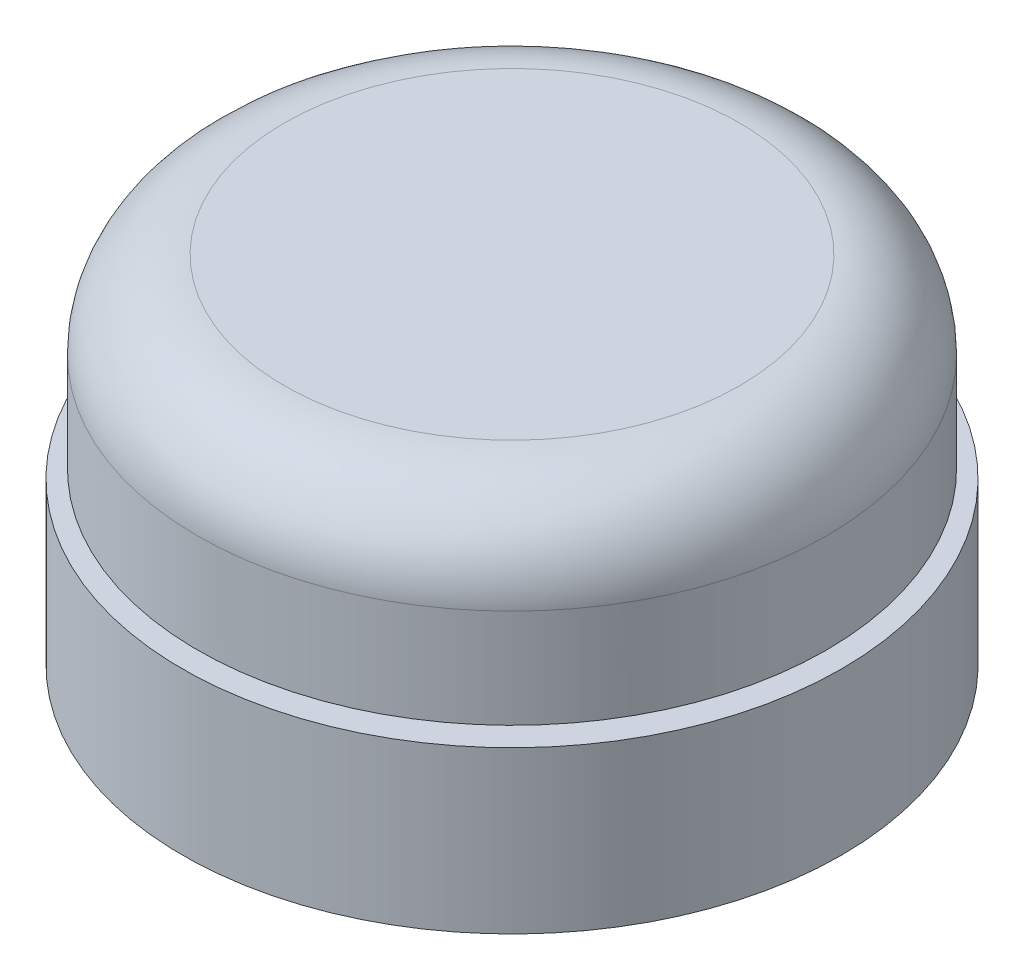
ISO-10303-21;
HEADER;
FILE_DESCRIPTION(('STEP AP214'),'2;1');
FILE_NAME('part.step','',(''),(''),'','','');
FILE_SCHEMA(('AUTOMOTIVE_DESIGN { 1 0 10303 214 1 1 1 1 }'));
ENDSEC;
DATA;
#1=APPLICATION_CONTEXT('core data for automotive mechanical design processes');
#2=APPLICATION_PROTOCOL_DEFINITION('international standard','automotive_design',2000,#1);
#3=PRODUCT_CONTEXT('',#1,'mechanical');
#4=PRODUCT('Part','Part','',(#3));
#5=PRODUCT_RELATED_PRODUCT_CATEGORY('part','',(#4));
#6=PRODUCT_DEFINITION_FORMATION('','',#4);
#7=PRODUCT_DEFINITION_CONTEXT('part definition',#1,'design');
#8=PRODUCT_DEFINITION('design','',#6,#7);
#9=PRODUCT_DEFINITION_SHAPE('','',#8);
#10=(LENGTH_UNIT() NAMED_UNIT(*) SI_UNIT(.MILLI.,.METRE.));
#11=(NAMED_UNIT(*) PLANE_ANGLE_UNIT() SI_UNIT($,.RADIAN.));
#12=(NAMED_UNIT(*) SI_UNIT($,.STERADIAN.) SOLID_ANGLE_UNIT());
#13=UNCERTAINTY_MEASURE_WITH_UNIT(LENGTH_MEASURE(1.E-05),#10,'distance_accuracy_value','');
#14=(GEOMETRIC_REPRESENTATION_CONTEXT(3) GLOBAL_UNCERTAINTY_ASSIGNED_CONTEXT((#13)) GLOBAL_UNIT_ASSIGNED_CONTEXT((#10,
#11,#12)) REPRESENTATION_CONTEXT('',''));
#15=CARTESIAN_POINT('',(0.,0.,0.));
#16=DIRECTION('',(0.,0.,1.));
#17=DIRECTION('',(1.,0.,0.));
#18=AXIS2_PLACEMENT_3D('',#15,#16,#17);
#19=CARTESIAN_POINT('',(0.,0.,0.));
#20=DIRECTION('',(0.,1.,0.));
#21=DIRECTION('',(1.,0.,0.));
#22=AXIS2_PLACEMENT_3D('',#19,#20,#21);
#23=PLANE('',#22);
#24=CARTESIAN_POINT('',(20.8596500450032,0.,-20.8596500450031));
#25=DIRECTION('',(0.,1.,0.));
#26=DIRECTION('',(1.,0.,0.));
#27=AXIS2_PLACEMENT_3D('',#24,#25,#26);
#28=CIRCLE('',#27,1.5);
#29=CARTESIAN_POINT('',(22.3596500450032,0.,-20.8596500450031));
#30=VERTEX_POINT('',#29);
#31=EDGE_CURVE('E56',#30,#30,#28,.T.);
#32=ORIENTED_EDGE('',*,*,#31,.T.);
#33=EDGE_LOOP('',(#32));
#34=FACE_BOUND('',#33,.T.);
#35=CARTESIAN_POINT('',(-20.8596500450031,0.,-20.8596500450032));
#36=DIRECTION('',(0.,1.,0.));
#37=DIRECTION('',(1.,0.,0.));
#38=AXIS2_PLACEMENT_3D('',#35,#36,#37);
#39=CIRCLE('',#38,1.5);
#40=CARTESIAN_POINT('',(-19.3596500450031,0.,-20.8596500450032));
#41=VERTEX_POINT('',#40);
#42=EDGE_CURVE('E64',#41,#41,#39,.T.);
#43=ORIENTED_EDGE('',*,*,#42,.T.);
#44=EDGE_LOOP('',(#43));
#45=FACE_BOUND('',#44,.T.);
#46=CARTESIAN_POINT('',(20.8596500450031,0.,20.8596500450032));
#47=DIRECTION('',(0.,1.,0.));
#48=DIRECTION('',(1.,0.,0.));
#49=AXIS2_PLACEMENT_3D('',#46,#47,#48);
#50=CIRCLE('',#49,1.5);
#51=CARTESIAN_POINT('',(22.3596500450031,0.,20.8596500450032));
#52=VERTEX_POINT('',#51);
#53=EDGE_CURVE('E69',#52,#52,#50,.T.);
#54=ORIENTED_EDGE('',*,*,#53,.T.);
#55=EDGE_LOOP('',(#54));
#56=FACE_BOUND('',#55,.T.);
#57=CARTESIAN_POINT('',(-20.8596500450032,0.,20.8596500450031));
#58=DIRECTION('',(0.,1.,0.));
#59=DIRECTION('',(1.,0.,0.));
#60=AXIS2_PLACEMENT_3D('',#57,#58,#59);
#61=CIRCLE('',#60,1.5);
#62=CARTESIAN_POINT('',(-19.3596500450032,0.,20.8596500450031));
#63=VERTEX_POINT('',#62);
#64=EDGE_CURVE('E77',#63,#63,#61,.T.);
#65=ORIENTED_EDGE('',*,*,#64,.T.);
#66=EDGE_LOOP('',(#65));
#67=FACE_BOUND('',#66,.T.);
#68=CARTESIAN_POINT('',(0.,0.,0.));
#69=DIRECTION('',(0.,1.,0.));
#70=DIRECTION('',(-1.,0.,0.));
#71=AXIS2_PLACEMENT_3D('',#68,#69,#70);
#72=CIRCLE('',#71,38.);
#73=CARTESIAN_POINT('',(-38.,0.,0.));
#74=VERTEX_POINT('',#73);
#75=EDGE_CURVE('E10',#74,#74,#72,.T.);
#76=ORIENTED_EDGE('',*,*,#75,.F.);
#77=EDGE_LOOP('',(#76));
#78=FACE_BOUND('',#77,.T.);
#79=ADVANCED_FACE('F15',(#34,#45,#56,#67,#78),#23,.F.);
#80=CARTESIAN_POINT('',(0.,18.6,0.));
#81=DIRECTION('',(0.,1.,0.));
#82=DIRECTION('',(1.,0.,0.));
#83=AXIS2_PLACEMENT_3D('',#80,#81,#82);
#84=PLANE('',#83);
#85=CARTESIAN_POINT('',(0.,18.6,0.));
#86=DIRECTION('',(0.,-1.,0.));
#87=DIRECTION('',(1.,0.,0.));
#88=AXIS2_PLACEMENT_3D('',#85,#86,#87);
#89=CIRCLE('',#88,32.5);
#90=CARTESIAN_POINT('',(32.5,18.6,0.));
#91=VERTEX_POINT('',#90);
#92=EDGE_CURVE('E31',#91,#91,#89,.T.);
#93=ORIENTED_EDGE('',*,*,#92,.T.);
#94=EDGE_LOOP('',(#93));
#95=FACE_BOUND('',#94,.T.);
#96=CARTESIAN_POINT('',(0.,18.6,0.));
#97=DIRECTION('',(0.,1.,0.));
#98=DIRECTION('',(-1.,0.,0.));
#99=AXIS2_PLACEMENT_3D('',#96,#97,#98);
#100=CIRCLE('',#99,38.);
#101=CARTESIAN_POINT('',(-38.,18.6,0.));
#102=VERTEX_POINT('',#101);
#103=EDGE_CURVE('E23',#102,#102,#100,.T.);
#104=ORIENTED_EDGE('',*,*,#103,.T.);
#105=EDGE_LOOP('',(#104));
#106=FACE_BOUND('',#105,.T.);
#107=ADVANCED_FACE('F105',(#95,#106),#84,.T.);
#108=CARTESIAN_POINT('',(0.,0.,0.));
#109=DIRECTION('',(0.,1.,0.));
#110=DIRECTION('',(-1.,0.,0.));
#111=AXIS2_PLACEMENT_3D('',#108,#109,#110);
#112=CYLINDRICAL_SURFACE('',#111,38.);
#113=ORIENTED_EDGE('',*,*,#75,.T.);
#114=EDGE_LOOP('',(#113));
#115=FACE_BOUND('',#114,.T.);
#116=ORIENTED_EDGE('',*,*,#103,.F.);
#117=EDGE_LOOP('',(#116));
#118=FACE_BOUND('',#117,.T.);
#119=ADVANCED_FACE('F17',(#115,#118),#112,.T.);
#120=CARTESIAN_POINT('',(0.,18.6,0.));
#121=DIRECTION('',(0.,1.,0.));
#122=DIRECTION('',(1.,0.,0.));
#123=AXIS2_PLACEMENT_3D('',#120,#121,#122);
#124=CYLINDRICAL_SURFACE('',#123,32.5);
#125=ORIENTED_EDGE('',*,*,#92,.F.);
#126=EDGE_LOOP('',(#125));
#127=FACE_BOUND('',#126,.T.);
#128=CARTESIAN_POINT('',(0.,19.6,0.));
#129=DIRECTION('',(0.,1.,0.));
#130=DIRECTION('',(1.,0.,0.));
#131=AXIS2_PLACEMENT_3D('',#128,#129,#130);
#132=CIRCLE('',#131,32.5);
#133=CARTESIAN_POINT('',(32.5,19.6,0.));
#134=VERTEX_POINT('',#133);
#135=EDGE_CURVE('E37',#134,#134,#132,.T.);
#136=ORIENTED_EDGE('',*,*,#135,.F.);
#137=EDGE_LOOP('',(#136));
#138=FACE_BOUND('',#137,.T.);
#139=ADVANCED_FACE('F124',(#127,#138),#124,.T.);
#140=CARTESIAN_POINT('',(0.,19.6,0.));
#141=DIRECTION('',(0.,1.,0.));
#142=DIRECTION('',(1.,0.,0.));
#143=AXIS2_PLACEMENT_3D('',#140,#141,#142);
#144=PLANE('',#143);
#145=ORIENTED_EDGE('',*,*,#135,.T.);
#146=EDGE_LOOP('',(#145));
#147=FACE_BOUND('',#146,.T.);
#148=CARTESIAN_POINT('',(0.,19.6,0.));
#149=DIRECTION('',(0.,1.,0.));
#150=DIRECTION('',(1.,0.,0.));
#151=AXIS2_PLACEMENT_3D('',#148,#149,#150);
#152=CIRCLE('',#151,36.25);
#153=CARTESIAN_POINT('',(36.25,19.6,0.));
#154=VERTEX_POINT('',#153);
#155=EDGE_CURVE('E43',#154,#154,#152,.T.);
#156=ORIENTED_EDGE('',*,*,#155,.F.);
#157=EDGE_LOOP('',(#156));
#158=FACE_BOUND('',#157,.T.);
#159=ADVANCED_FACE('F127',(#147,#158),#144,.F.);
#160=CARTESIAN_POINT('',(0.,41.,0.));
#161=DIRECTION('',(0.,1.,0.));
#162=DIRECTION('',(1.,0.,0.));
#163=AXIS2_PLACEMENT_3D('',#160,#161,#162);
#164=PLANE('',#163);
#165=CARTESIAN_POINT('',(0.,41.,0.));
#166=DIRECTION('',(0.,-1.,0.));
#167=DIRECTION('',(-1.,0.,0.));
#168=AXIS2_PLACEMENT_3D('',#165,#166,#167);
#169=CIRCLE('',#168,26.25);
#170=CARTESIAN_POINT('',(-26.25,41.,0.));
#171=VERTEX_POINT('',#170);
#172=EDGE_CURVE('E48',#171,#171,#169,.T.);
#173=ORIENTED_EDGE('',*,*,#172,.F.);
#174=EDGE_LOOP('',(#173));
#175=FACE_BOUND('',#174,.T.);
#176=ADVANCED_FACE('F121',(#175),#164,.T.);
#177=CARTESIAN_POINT('',(0.,19.6,0.));
#178=DIRECTION('',(0.,1.,0.));
#179=DIRECTION('',(1.,0.,0.));
#180=AXIS2_PLACEMENT_3D('',#177,#178,#179);
#181=CYLINDRICAL_SURFACE('',#180,36.25);
#182=ORIENTED_EDGE('',*,*,#155,.T.);
#183=EDGE_LOOP('',(#182));
#184=FACE_BOUND('',#183,.T.);
#185=CARTESIAN_POINT('',(0.,31.,0.));
#186=DIRECTION('',(0.,1.,0.));
#187=DIRECTION('',(-1.,0.,0.));
#188=AXIS2_PLACEMENT_3D('',#185,#186,#187);
#189=CIRCLE('',#188,36.25);
#190=CARTESIAN_POINT('',(-36.25,31.,0.));
#191=VERTEX_POINT('',#190);
#192=EDGE_CURVE('E47',#191,#191,#189,.T.);
#193=ORIENTED_EDGE('',*,*,#192,.F.);
#194=EDGE_LOOP('',(#193));
#195=FACE_BOUND('',#194,.T.);
#196=ADVANCED_FACE('F118',(#184,#195),#181,.T.);
#197=CARTESIAN_POINT('',(0.,31.,0.));
#198=DIRECTION('',(0.,1.,0.));
#199=DIRECTION('',(0.,0.,1.));
#200=AXIS2_PLACEMENT_3D('',#197,#198,#199);
#201=TOROIDAL_SURFACE('',#200,26.25,10.);
#202=ORIENTED_EDGE('',*,*,#192,.T.);
#203=EDGE_LOOP('',(#202));
#204=FACE_BOUND('',#203,.T.);
#205=ORIENTED_EDGE('',*,*,#172,.T.);
#206=EDGE_LOOP('',(#205));
#207=FACE_BOUND('',#206,.T.);
#208=ADVANCED_FACE('F120',(#204,#207),#201,.T.);
#209=CARTESIAN_POINT('',(20.8596500450032,4.,-20.8596500450031));
#210=DIRECTION('',(0.,-1.,0.));
#211=DIRECTION('',(0.,0.,-1.));
#212=AXIS2_PLACEMENT_3D('',#209,#210,#211);
#213=PLANE('',#212);
#214=CARTESIAN_POINT('',(20.8596500450032,4.,-20.8596500450031));
#215=DIRECTION('',(0.,1.,0.));
#216=DIRECTION('',(1.,0.,0.));
#217=AXIS2_PLACEMENT_3D('',#214,#215,#216);
#218=CIRCLE('',#217,1.5);
#219=CARTESIAN_POINT('',(22.3596500450032,4.,-20.8596500450031));
#220=VERTEX_POINT('',#219);
#221=EDGE_CURVE('E52',#220,#220,#218,.T.);
#222=ORIENTED_EDGE('',*,*,#221,.F.);
#223=EDGE_LOOP('',(#222));
#224=FACE_BOUND('',#223,.T.);
#225=ADVANCED_FACE('F116',(#224),#213,.T.);
#226=CARTESIAN_POINT('',(20.8596500450032,0.,-20.8596500450031));
#227=DIRECTION('',(0.,1.,0.));
#228=DIRECTION('',(1.,0.,0.));
#229=AXIS2_PLACEMENT_3D('',#226,#227,#228);
#230=CYLINDRICAL_SURFACE('',#229,1.5);
#231=ORIENTED_EDGE('',*,*,#221,.T.);
#232=EDGE_LOOP('',(#231));
#233=FACE_BOUND('',#232,.T.);
#234=ORIENTED_EDGE('',*,*,#31,.F.);
#235=EDGE_LOOP('',(#234));
#236=FACE_BOUND('',#235,.T.);
#237=ADVANCED_FACE('F143',(#233,#236),#230,.F.);
#238=CARTESIAN_POINT('',(-20.8596500450031,4.,-20.8596500450032));
#239=DIRECTION('',(0.,-1.,0.));
#240=DIRECTION('',(0.,0.,-1.));
#241=AXIS2_PLACEMENT_3D('',#238,#239,#240);
#242=PLANE('',#241);
#243=CARTESIAN_POINT('',(-20.8596500450031,4.,-20.8596500450032));
#244=DIRECTION('',(0.,1.,0.));
#245=DIRECTION('',(1.,0.,0.));
#246=AXIS2_PLACEMENT_3D('',#243,#244,#245);
#247=CIRCLE('',#246,1.5);
#248=CARTESIAN_POINT('',(-19.3596500450031,4.,-20.8596500450032));
#249=VERTEX_POINT('',#248);
#250=EDGE_CURVE('E60',#249,#249,#247,.T.);
#251=ORIENTED_EDGE('',*,*,#250,.F.);
#252=EDGE_LOOP('',(#251));
#253=FACE_BOUND('',#252,.T.);
#254=ADVANCED_FACE('F152',(#253),#242,.T.);
#255=CARTESIAN_POINT('',(-20.8596500450031,0.,-20.8596500450032));
#256=DIRECTION('',(0.,1.,0.));
#257=DIRECTION('',(1.,0.,0.));
#258=AXIS2_PLACEMENT_3D('',#255,#256,#257);
#259=CYLINDRICAL_SURFACE('',#258,1.5);
#260=ORIENTED_EDGE('',*,*,#250,.T.);
#261=EDGE_LOOP('',(#260));
#262=FACE_BOUND('',#261,.T.);
#263=ORIENTED_EDGE('',*,*,#42,.F.);
#264=EDGE_LOOP('',(#263));
#265=FACE_BOUND('',#264,.T.);
#266=ADVANCED_FACE('F149',(#262,#265),#259,.F.);
#267=CARTESIAN_POINT('',(20.8596500450031,4.,20.8596500450032));
#268=DIRECTION('',(0.,-1.,0.));
#269=DIRECTION('',(0.,0.,-1.));
#270=AXIS2_PLACEMENT_3D('',#267,#268,#269);
#271=PLANE('',#270);
#272=CARTESIAN_POINT('',(20.8596500450031,4.,20.8596500450032));
#273=DIRECTION('',(0.,1.,0.));
#274=DIRECTION('',(1.,0.,0.));
#275=AXIS2_PLACEMENT_3D('',#272,#273,#274);
#276=CIRCLE('',#275,1.5);
#277=CARTESIAN_POINT('',(22.3596500450031,4.,20.8596500450032));
#278=VERTEX_POINT('',#277);
#279=EDGE_CURVE('E68',#278,#278,#276,.T.);
#280=ORIENTED_EDGE('',*,*,#279,.F.);
#281=EDGE_LOOP('',(#280));
#282=FACE_BOUND('',#281,.T.);
#283=ADVANCED_FACE('F146',(#282),#271,.T.);
#284=CARTESIAN_POINT('',(20.8596500450031,0.,20.8596500450032));
#285=DIRECTION('',(0.,1.,0.));
#286=DIRECTION('',(1.,0.,0.));
#287=AXIS2_PLACEMENT_3D('',#284,#285,#286);
#288=CYLINDRICAL_SURFACE('',#287,1.5);
#289=ORIENTED_EDGE('',*,*,#279,.T.);
#290=EDGE_LOOP('',(#289));
#291=FACE_BOUND('',#290,.T.);
#292=ORIENTED_EDGE('',*,*,#53,.F.);
#293=EDGE_LOOP('',(#292));
#294=FACE_BOUND('',#293,.T.);
#295=ADVANCED_FACE('F100',(#291,#294),#288,.F.);
#296=CARTESIAN_POINT('',(-20.8596500450032,4.,20.8596500450031));
#297=DIRECTION('',(0.,-1.,0.));
#298=DIRECTION('',(0.,0.,-1.));
#299=AXIS2_PLACEMENT_3D('',#296,#297,#298);
#300=PLANE('',#299);
#301=CARTESIAN_POINT('',(-20.8596500450032,4.,20.8596500450031));
#302=DIRECTION('',(0.,1.,0.));
#303=DIRECTION('',(1.,0.,0.));
#304=AXIS2_PLACEMENT_3D('',#301,#302,#303);
#305=CIRCLE('',#304,1.5);
#306=CARTESIAN_POINT('',(-19.3596500450032,4.,20.8596500450031));
#307=VERTEX_POINT('',#306);
#308=EDGE_CURVE('E73',#307,#307,#305,.T.);
#309=ORIENTED_EDGE('',*,*,#308,.F.);
#310=EDGE_LOOP('',(#309));
#311=FACE_BOUND('',#310,.T.);
#312=ADVANCED_FACE('F93',(#311),#300,.T.);
#313=CARTESIAN_POINT('',(-20.8596500450032,0.,20.8596500450031));
#314=DIRECTION('',(0.,1.,0.));
#315=DIRECTION('',(1.,0.,0.));
#316=AXIS2_PLACEMENT_3D('',#313,#314,#315);
#317=CYLINDRICAL_SURFACE('',#316,1.5);
#318=ORIENTED_EDGE('',*,*,#308,.T.);
#319=EDGE_LOOP('',(#318));
#320=FACE_BOUND('',#319,.T.);
#321=ORIENTED_EDGE('',*,*,#64,.F.);
#322=EDGE_LOOP('',(#321));
#323=FACE_BOUND('',#322,.T.);
#324=ADVANCED_FACE('F91',(#320,#323),#317,.F.);
#325=CLOSED_SHELL('',(#79,#107,#119,#139,#159,#176,#196,#208,#225,#237,#254,#266,#283,#295,#312,#324));
#326=MANIFOLD_SOLID_BREP('B1',#325);
#327=ADVANCED_BREP_SHAPE_REPRESENTATION('',(#18,#326),#14);
#328=SHAPE_DEFINITION_REPRESENTATION(#9,#327);
ENDSEC;
END-ISO-10303-21;
